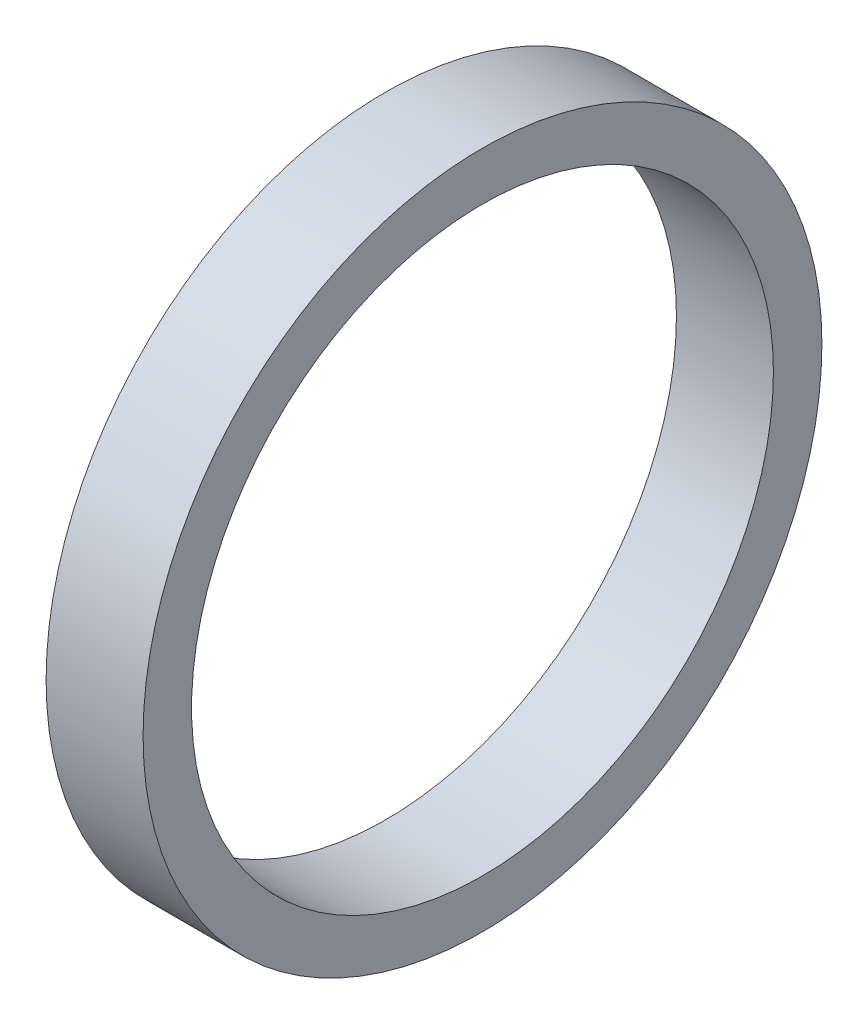
ISO-10303-21;
HEADER;
FILE_DESCRIPTION(('STEP AP214'),'2;1');
FILE_NAME('part.step','',(''),(''),'','','');
FILE_SCHEMA(('AUTOMOTIVE_DESIGN { 1 0 10303 214 1 1 1 1 }'));
ENDSEC;
DATA;
#1=APPLICATION_CONTEXT('core data for automotive mechanical design processes');
#2=APPLICATION_PROTOCOL_DEFINITION('international standard','automotive_design',2000,#1);
#3=PRODUCT_CONTEXT('',#1,'mechanical');
#4=PRODUCT('Part','Part','',(#3));
#5=PRODUCT_RELATED_PRODUCT_CATEGORY('part','',(#4));
#6=PRODUCT_DEFINITION_FORMATION('','',#4);
#7=PRODUCT_DEFINITION_CONTEXT('part definition',#1,'design');
#8=PRODUCT_DEFINITION('design','',#6,#7);
#9=PRODUCT_DEFINITION_SHAPE('','',#8);
#10=(LENGTH_UNIT() NAMED_UNIT(*) SI_UNIT(.MILLI.,.METRE.));
#11=(NAMED_UNIT(*) PLANE_ANGLE_UNIT() SI_UNIT($,.RADIAN.));
#12=(NAMED_UNIT(*) SI_UNIT($,.STERADIAN.) SOLID_ANGLE_UNIT());
#13=UNCERTAINTY_MEASURE_WITH_UNIT(LENGTH_MEASURE(1.E-05),#10,'distance_accuracy_value','');
#14=(GEOMETRIC_REPRESENTATION_CONTEXT(3) GLOBAL_UNCERTAINTY_ASSIGNED_CONTEXT((#13)) GLOBAL_UNIT_ASSIGNED_CONTEXT((#10,
#11,#12)) REPRESENTATION_CONTEXT('',''));
#15=CARTESIAN_POINT('',(0.,0.,0.));
#16=DIRECTION('',(0.,0.,1.));
#17=DIRECTION('',(1.,0.,0.));
#18=AXIS2_PLACEMENT_3D('',#15,#16,#17);
#19=CARTESIAN_POINT('',(1.,0.,0.));
#20=DIRECTION('',(1.,0.,0.));
#21=DIRECTION('',(0.,0.,-1.));
#22=AXIS2_PLACEMENT_3D('',#19,#20,#21);
#23=PLANE('',#22);
#24=CARTESIAN_POINT('',(1.,0.,0.));
#25=DIRECTION('',(1.,0.,0.));
#26=DIRECTION('',(0.,0.,-1.));
#27=AXIS2_PLACEMENT_3D('',#24,#25,#26);
#28=CIRCLE('',#27,3.5);
#29=CARTESIAN_POINT('',(1.,0.,-3.5));
#30=VERTEX_POINT('',#29);
#31=EDGE_CURVE('E10',#30,#30,#28,.T.);
#32=ORIENTED_EDGE('',*,*,#31,.T.);
#33=EDGE_LOOP('',(#32));
#34=FACE_BOUND('',#33,.T.);
#35=CARTESIAN_POINT('',(1.,0.,0.));
#36=DIRECTION('',(1.,0.,0.));
#37=DIRECTION('',(0.,0.,-1.));
#38=AXIS2_PLACEMENT_3D('',#35,#36,#37);
#39=CIRCLE('',#38,3.);
#40=CARTESIAN_POINT('',(1.,0.,-3.));
#41=VERTEX_POINT('',#40);
#42=EDGE_CURVE('E44',#41,#41,#39,.T.);
#43=ORIENTED_EDGE('',*,*,#42,.F.);
#44=EDGE_LOOP('',(#43));
#45=FACE_BOUND('',#44,.T.);
#46=ADVANCED_FACE('F33',(#34,#45),#23,.T.);
#47=CARTESIAN_POINT('',(0.,0.,0.));
#48=DIRECTION('',(1.,0.,0.));
#49=DIRECTION('',(0.,0.,-1.));
#50=AXIS2_PLACEMENT_3D('',#47,#48,#49);
#51=PLANE('',#50);
#52=CARTESIAN_POINT('',(0.,0.,0.));
#53=DIRECTION('',(1.,0.,0.));
#54=DIRECTION('',(0.,0.,-1.));
#55=AXIS2_PLACEMENT_3D('',#52,#53,#54);
#56=CIRCLE('',#55,3.5);
#57=CARTESIAN_POINT('',(0.,0.,-3.5));
#58=VERTEX_POINT('',#57);
#59=EDGE_CURVE('E37',#58,#58,#56,.T.);
#60=ORIENTED_EDGE('',*,*,#59,.F.);
#61=EDGE_LOOP('',(#60));
#62=FACE_BOUND('',#61,.T.);
#63=CARTESIAN_POINT('',(0.,0.,0.));
#64=DIRECTION('',(1.,0.,0.));
#65=DIRECTION('',(0.,0.,-1.));
#66=AXIS2_PLACEMENT_3D('',#63,#64,#65);
#67=CIRCLE('',#66,3.);
#68=CARTESIAN_POINT('',(0.,0.,-3.));
#69=VERTEX_POINT('',#68);
#70=EDGE_CURVE('E46',#69,#69,#67,.T.);
#71=ORIENTED_EDGE('',*,*,#70,.T.);
#72=EDGE_LOOP('',(#71));
#73=FACE_BOUND('',#72,.T.);
#74=ADVANCED_FACE('F56',(#62,#73),#51,.F.);
#75=CARTESIAN_POINT('',(1.,0.,0.));
#76=DIRECTION('',(-1.,0.,0.));
#77=DIRECTION('',(0.,0.,1.));
#78=AXIS2_PLACEMENT_3D('',#75,#76,#77);
#79=CYLINDRICAL_SURFACE('',#78,3.5);
#80=ORIENTED_EDGE('',*,*,#31,.F.);
#81=EDGE_LOOP('',(#80));
#82=FACE_BOUND('',#81,.T.);
#83=ORIENTED_EDGE('',*,*,#59,.T.);
#84=EDGE_LOOP('',(#83));
#85=FACE_BOUND('',#84,.T.);
#86=ADVANCED_FACE('F35',(#82,#85),#79,.T.);
#87=CARTESIAN_POINT('',(1.,0.,0.));
#88=DIRECTION('',(-1.,0.,0.));
#89=DIRECTION('',(0.,0.,1.));
#90=AXIS2_PLACEMENT_3D('',#87,#88,#89);
#91=CYLINDRICAL_SURFACE('',#90,3.);
#92=ORIENTED_EDGE('',*,*,#42,.T.);
#93=EDGE_LOOP('',(#92));
#94=FACE_BOUND('',#93,.T.);
#95=ORIENTED_EDGE('',*,*,#70,.F.);
#96=EDGE_LOOP('',(#95));
#97=FACE_BOUND('',#96,.T.);
#98=ADVANCED_FACE('F52',(#94,#97),#91,.F.);
#99=CLOSED_SHELL('',(#46,#74,#86,#98));
#100=MANIFOLD_SOLID_BREP('B2',#99);
#101=ADVANCED_BREP_SHAPE_REPRESENTATION('',(#18,#100),#14);
#102=SHAPE_DEFINITION_REPRESENTATION(#9,#101);
ENDSEC;
END-ISO-10303-21;
